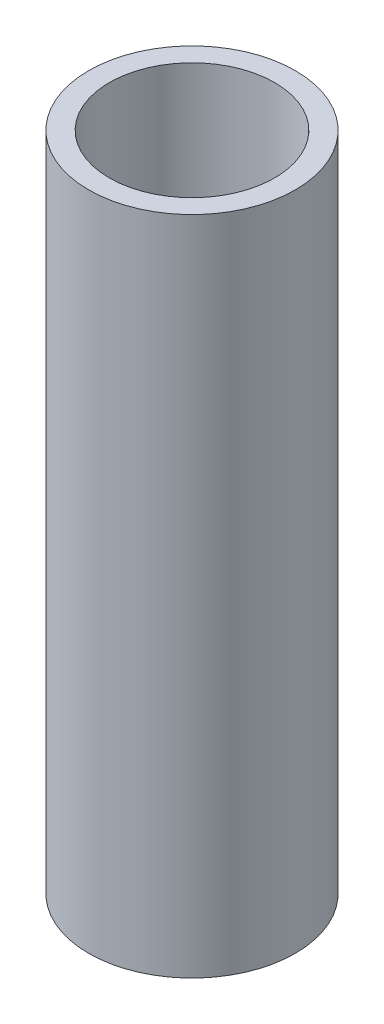
ISO-10303-21;
HEADER;
FILE_DESCRIPTION(('STEP AP214'),'2;1');
FILE_NAME('part.step','',(''),(''),'','','');
FILE_SCHEMA(('AUTOMOTIVE_DESIGN { 1 0 10303 214 1 1 1 1 }'));
ENDSEC;
DATA;
#1=APPLICATION_CONTEXT('core data for automotive mechanical design processes');
#2=APPLICATION_PROTOCOL_DEFINITION('international standard','automotive_design',2000,#1);
#3=PRODUCT_CONTEXT('',#1,'mechanical');
#4=PRODUCT('Part','Part','',(#3));
#5=PRODUCT_RELATED_PRODUCT_CATEGORY('part','',(#4));
#6=PRODUCT_DEFINITION_FORMATION('','',#4);
#7=PRODUCT_DEFINITION_CONTEXT('part definition',#1,'design');
#8=PRODUCT_DEFINITION('design','',#6,#7);
#9=PRODUCT_DEFINITION_SHAPE('','',#8);
#10=(LENGTH_UNIT() NAMED_UNIT(*) SI_UNIT(.MILLI.,.METRE.));
#11=(NAMED_UNIT(*) PLANE_ANGLE_UNIT() SI_UNIT($,.RADIAN.));
#12=(NAMED_UNIT(*) SI_UNIT($,.STERADIAN.) SOLID_ANGLE_UNIT());
#13=UNCERTAINTY_MEASURE_WITH_UNIT(LENGTH_MEASURE(1.E-05),#10,'distance_accuracy_value','');
#14=(GEOMETRIC_REPRESENTATION_CONTEXT(3) GLOBAL_UNCERTAINTY_ASSIGNED_CONTEXT((#13)) GLOBAL_UNIT_ASSIGNED_CONTEXT((#10,
#11,#12)) REPRESENTATION_CONTEXT('',''));
#15=CARTESIAN_POINT('',(0.,0.,0.));
#16=DIRECTION('',(0.,0.,1.));
#17=DIRECTION('',(1.,0.,0.));
#18=AXIS2_PLACEMENT_3D('',#15,#16,#17);
#19=CARTESIAN_POINT('',(0.,128.,0.));
#20=DIRECTION('',(0.,-1.,0.));
#21=DIRECTION('',(0.,0.,-1.));
#22=AXIS2_PLACEMENT_3D('',#19,#20,#21);
#23=CYLINDRICAL_SURFACE('',#22,13.5);
#24=CARTESIAN_POINT('',(0.,0.,0.));
#25=DIRECTION('',(0.,1.,0.));
#26=DIRECTION('',(0.,0.,1.));
#27=AXIS2_PLACEMENT_3D('',#24,#25,#26);
#28=CIRCLE('',#27,13.5);
#29=CARTESIAN_POINT('',(0.,0.,13.5));
#30=VERTEX_POINT('',#29);
#31=EDGE_CURVE('E46',#30,#30,#28,.T.);
#32=ORIENTED_EDGE('',*,*,#31,.F.);
#33=EDGE_LOOP('',(#32));
#34=FACE_BOUND('',#33,.T.);
#35=CARTESIAN_POINT('',(0.,100.,0.));
#36=DIRECTION('',(0.,1.,0.));
#37=DIRECTION('',(0.,0.,1.));
#38=AXIS2_PLACEMENT_3D('',#35,#36,#37);
#39=CIRCLE('',#38,13.5);
#40=CARTESIAN_POINT('',(0.,100.,13.5));
#41=VERTEX_POINT('',#40);
#42=EDGE_CURVE('E37',#41,#41,#39,.T.);
#43=ORIENTED_EDGE('',*,*,#42,.T.);
#44=EDGE_LOOP('',(#43));
#45=FACE_BOUND('',#44,.T.);
#46=ADVANCED_FACE('F33',(#34,#45),#23,.F.);
#47=CARTESIAN_POINT('',(0.,128.,0.));
#48=DIRECTION('',(0.,1.,0.));
#49=DIRECTION('',(0.,0.,1.));
#50=AXIS2_PLACEMENT_3D('',#47,#48,#49);
#51=PLANE('',#50);
#52=CARTESIAN_POINT('',(0.,128.,0.));
#53=DIRECTION('',(0.,1.,0.));
#54=DIRECTION('',(0.,0.,1.));
#55=AXIS2_PLACEMENT_3D('',#52,#53,#54);
#56=CIRCLE('',#55,16.);
#57=CARTESIAN_POINT('',(0.,128.,16.));
#58=VERTEX_POINT('',#57);
#59=EDGE_CURVE('E50',#58,#58,#56,.T.);
#60=ORIENTED_EDGE('',*,*,#59,.F.);
#61=EDGE_LOOP('',(#60));
#62=FACE_BOUND('',#61,.T.);
#63=CARTESIAN_POINT('',(0.,128.,0.));
#64=DIRECTION('',(0.,1.,0.));
#65=DIRECTION('',(0.,0.,1.));
#66=AXIS2_PLACEMENT_3D('',#63,#64,#65);
#67=CIRCLE('',#66,20.);
#68=CARTESIAN_POINT('',(0.,128.,20.));
#69=VERTEX_POINT('',#68);
#70=EDGE_CURVE('E10',#69,#69,#67,.T.);
#71=ORIENTED_EDGE('',*,*,#70,.T.);
#72=EDGE_LOOP('',(#71));
#73=FACE_BOUND('',#72,.T.);
#74=ADVANCED_FACE('F71',(#62,#73),#51,.T.);
#75=CARTESIAN_POINT('',(0.,0.,0.));
#76=DIRECTION('',(0.,1.,0.));
#77=DIRECTION('',(0.,0.,1.));
#78=AXIS2_PLACEMENT_3D('',#75,#76,#77);
#79=PLANE('',#78);
#80=CARTESIAN_POINT('',(0.,0.,0.));
#81=DIRECTION('',(0.,1.,0.));
#82=DIRECTION('',(0.,0.,1.));
#83=AXIS2_PLACEMENT_3D('',#80,#81,#82);
#84=CIRCLE('',#83,20.);
#85=CARTESIAN_POINT('',(0.,0.,20.));
#86=VERTEX_POINT('',#85);
#87=EDGE_CURVE('E41',#86,#86,#84,.T.);
#88=ORIENTED_EDGE('',*,*,#87,.F.);
#89=EDGE_LOOP('',(#88));
#90=FACE_BOUND('',#89,.T.);
#91=ORIENTED_EDGE('',*,*,#31,.T.);
#92=EDGE_LOOP('',(#91));
#93=FACE_BOUND('',#92,.T.);
#94=ADVANCED_FACE('F77',(#90,#93),#79,.F.);
#95=CARTESIAN_POINT('',(0.,128.,0.));
#96=DIRECTION('',(0.,-1.,0.));
#97=DIRECTION('',(0.,0.,-1.));
#98=AXIS2_PLACEMENT_3D('',#95,#96,#97);
#99=CYLINDRICAL_SURFACE('',#98,20.);
#100=ORIENTED_EDGE('',*,*,#70,.F.);
#101=EDGE_LOOP('',(#100));
#102=FACE_BOUND('',#101,.T.);
#103=ORIENTED_EDGE('',*,*,#87,.T.);
#104=EDGE_LOOP('',(#103));
#105=FACE_BOUND('',#104,.T.);
#106=ADVANCED_FACE('F35',(#102,#105),#99,.T.);
#107=CARTESIAN_POINT('',(0.,100.,0.));
#108=DIRECTION('',(0.,1.,0.));
#109=DIRECTION('',(0.,0.,1.));
#110=AXIS2_PLACEMENT_3D('',#107,#108,#109);
#111=CYLINDRICAL_SURFACE('',#110,16.);
#112=CARTESIAN_POINT('',(0.,100.,0.));
#113=DIRECTION('',(0.,1.,0.));
#114=DIRECTION('',(0.,0.,1.));
#115=AXIS2_PLACEMENT_3D('',#112,#113,#114);
#116=CIRCLE('',#115,16.);
#117=CARTESIAN_POINT('',(0.,100.,16.));
#118=VERTEX_POINT('',#117);
#119=EDGE_CURVE('E53',#118,#118,#116,.T.);
#120=ORIENTED_EDGE('',*,*,#119,.F.);
#121=EDGE_LOOP('',(#120));
#122=FACE_BOUND('',#121,.T.);
#123=ORIENTED_EDGE('',*,*,#59,.T.);
#124=EDGE_LOOP('',(#123));
#125=FACE_BOUND('',#124,.T.);
#126=ADVANCED_FACE('F63',(#122,#125),#111,.F.);
#127=CARTESIAN_POINT('',(0.,100.,0.));
#128=DIRECTION('',(0.,1.,0.));
#129=DIRECTION('',(0.,0.,1.));
#130=AXIS2_PLACEMENT_3D('',#127,#128,#129);
#131=PLANE('',#130);
#132=ORIENTED_EDGE('',*,*,#42,.F.);
#133=EDGE_LOOP('',(#132));
#134=FACE_BOUND('',#133,.T.);
#135=ORIENTED_EDGE('',*,*,#119,.T.);
#136=EDGE_LOOP('',(#135));
#137=FACE_BOUND('',#136,.T.);
#138=ADVANCED_FACE('F61',(#134,#137),#131,.T.);
#139=CLOSED_SHELL('',(#46,#74,#94,#106,#126,#138));
#140=MANIFOLD_SOLID_BREP('B2',#139);
#141=ADVANCED_BREP_SHAPE_REPRESENTATION('',(#18,#140),#14);
#142=SHAPE_DEFINITION_REPRESENTATION(#9,#141);
ENDSEC;
END-ISO-10303-21;
